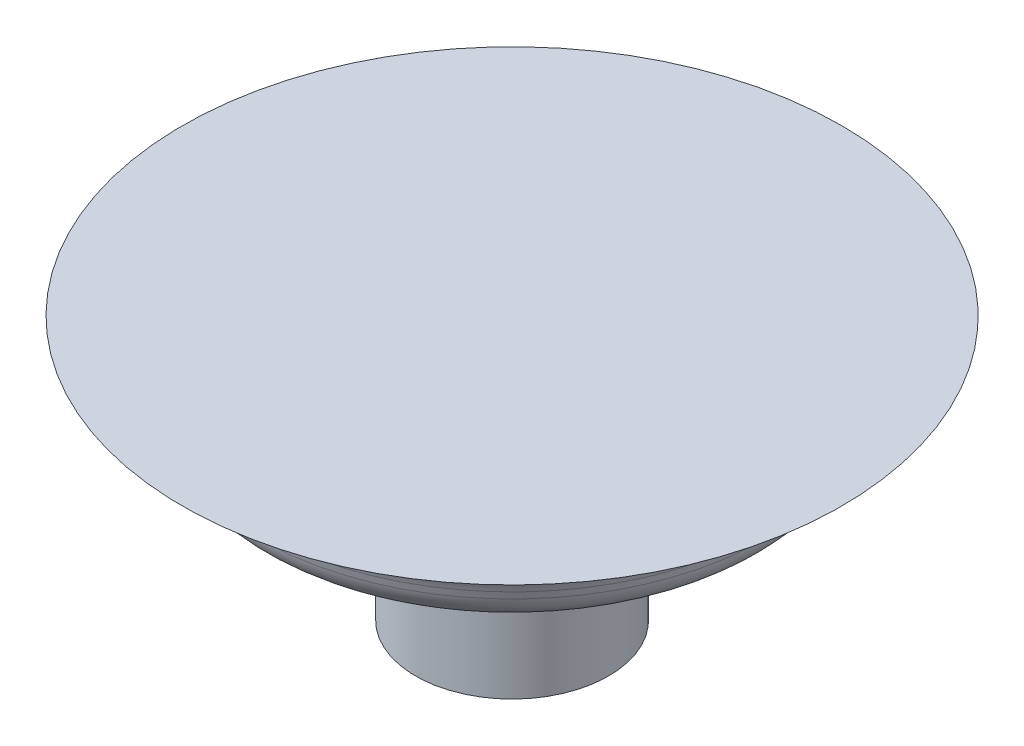
ISO-10303-21;
HEADER;
FILE_DESCRIPTION(('STEP AP214'),'2;1');
FILE_NAME('part.step','',(''),(''),'','','');
FILE_SCHEMA(('AUTOMOTIVE_DESIGN { 1 0 10303 214 1 1 1 1 }'));
ENDSEC;
DATA;
#1=APPLICATION_CONTEXT('core data for automotive mechanical design processes');
#2=APPLICATION_PROTOCOL_DEFINITION('international standard','automotive_design',2000,#1);
#3=PRODUCT_CONTEXT('',#1,'mechanical');
#4=PRODUCT('Part','Part','',(#3));
#5=PRODUCT_RELATED_PRODUCT_CATEGORY('part','',(#4));
#6=PRODUCT_DEFINITION_FORMATION('','',#4);
#7=PRODUCT_DEFINITION_CONTEXT('part definition',#1,'design');
#8=PRODUCT_DEFINITION('design','',#6,#7);
#9=PRODUCT_DEFINITION_SHAPE('','',#8);
#10=(LENGTH_UNIT() NAMED_UNIT(*) SI_UNIT(.MILLI.,.METRE.));
#11=(NAMED_UNIT(*) PLANE_ANGLE_UNIT() SI_UNIT($,.RADIAN.));
#12=(NAMED_UNIT(*) SI_UNIT($,.STERADIAN.) SOLID_ANGLE_UNIT());
#13=UNCERTAINTY_MEASURE_WITH_UNIT(LENGTH_MEASURE(1.E-05),#10,'distance_accuracy_value','');
#14=(GEOMETRIC_REPRESENTATION_CONTEXT(3) GLOBAL_UNCERTAINTY_ASSIGNED_CONTEXT((#13)) GLOBAL_UNIT_ASSIGNED_CONTEXT((#10,
#11,#12)) REPRESENTATION_CONTEXT('',''));
#15=CARTESIAN_POINT('',(0.,0.,0.));
#16=DIRECTION('',(0.,0.,1.));
#17=DIRECTION('',(1.,0.,0.));
#18=AXIS2_PLACEMENT_3D('',#15,#16,#17);
#19=CARTESIAN_POINT('',(0.,0.,0.));
#20=DIRECTION('',(0.,1.,0.));
#21=DIRECTION('',(0.,0.,1.));
#22=AXIS2_PLACEMENT_3D('',#19,#20,#21);
#23=PLANE('',#22);
#24=CARTESIAN_POINT('',(0.,0.,0.));
#25=DIRECTION('',(0.,-1.,0.));
#26=DIRECTION('',(0.,0.,-1.));
#27=AXIS2_PLACEMENT_3D('',#24,#25,#26);
#28=CIRCLE('',#27,3.5);
#29=CARTESIAN_POINT('',(0.,0.,-3.5));
#30=VERTEX_POINT('',#29);
#31=EDGE_CURVE('E60',#30,#30,#28,.T.);
#32=ORIENTED_EDGE('',*,*,#31,.F.);
#33=EDGE_LOOP('',(#32));
#34=FACE_BOUND('',#33,.T.);
#35=ADVANCED_FACE('F38',(#34),#23,.T.);
#36=CARTESIAN_POINT('',(0.,-2.8,0.));
#37=DIRECTION('',(0.,-1.,0.));
#38=DIRECTION('',(0.,0.,-1.));
#39=AXIS2_PLACEMENT_3D('',#36,#37,#38);
#40=PLANE('',#39);
#41=CARTESIAN_POINT('',(0.,-2.8,0.));
#42=DIRECTION('',(0.,-1.,0.));
#43=DIRECTION('',(0.,0.,-1.));
#44=AXIS2_PLACEMENT_3D('',#41,#42,#43);
#45=CIRCLE('',#44,1.025);
#46=CARTESIAN_POINT('',(0.,-2.8,-1.025));
#47=VERTEX_POINT('',#46);
#48=EDGE_CURVE('E11',#47,#47,#45,.T.);
#49=ORIENTED_EDGE('',*,*,#48,.T.);
#50=EDGE_LOOP('',(#49));
#51=FACE_BOUND('',#50,.T.);
#52=ADVANCED_FACE('F68',(#51),#40,.T.);
#53=CARTESIAN_POINT('',(0.,0.,0.));
#54=DIRECTION('',(0.,-1.,0.));
#55=DIRECTION('',(0.,0.,-1.));
#56=AXIS2_PLACEMENT_3D('',#53,#54,#55);
#57=CYLINDRICAL_SURFACE('',#56,1.025);
#58=CARTESIAN_POINT('',(0.,-1.,0.));
#59=DIRECTION('',(0.,-1.,0.));
#60=DIRECTION('',(0.,0.,-1.));
#61=AXIS2_PLACEMENT_3D('',#58,#59,#60);
#62=CIRCLE('',#61,1.025);
#63=CARTESIAN_POINT('',(0.,-1.,-1.025));
#64=VERTEX_POINT('',#63);
#65=EDGE_CURVE('E44',#64,#64,#62,.T.);
#66=ORIENTED_EDGE('',*,*,#65,.T.);
#67=EDGE_LOOP('',(#66));
#68=FACE_BOUND('',#67,.T.);
#69=ORIENTED_EDGE('',*,*,#48,.F.);
#70=EDGE_LOOP('',(#69));
#71=FACE_BOUND('',#70,.T.);
#72=ADVANCED_FACE('F72',(#68,#71),#57,.T.);
#73=CARTESIAN_POINT('',(1.025,-1.,0.));
#74=DIRECTION('',(0.,-1.,0.));
#75=DIRECTION('',(0.,0.,-1.));
#76=AXIS2_PLACEMENT_3D('',#73,#74,#75);
#77=PLANE('',#76);
#78=CARTESIAN_POINT('',(0.,-1.,0.));
#79=DIRECTION('',(0.,-1.,0.));
#80=DIRECTION('',(0.,0.,-1.));
#81=AXIS2_PLACEMENT_3D('',#78,#79,#80);
#82=CIRCLE('',#81,2.31408679581417);
#83=CARTESIAN_POINT('',(0.,-1.,-2.31408679581417));
#84=VERTEX_POINT('',#83);
#85=EDGE_CURVE('E48',#84,#84,#82,.T.);
#86=ORIENTED_EDGE('',*,*,#85,.T.);
#87=EDGE_LOOP('',(#86));
#88=FACE_BOUND('',#87,.T.);
#89=ORIENTED_EDGE('',*,*,#65,.F.);
#90=EDGE_LOOP('',(#89));
#91=FACE_BOUND('',#90,.T.);
#92=ADVANCED_FACE('F76',(#88,#91),#77,.T.);
#93=CARTESIAN_POINT('',(0.,-0.6,0.));
#94=DIRECTION('',(0.,-1.,0.));
#95=DIRECTION('',(0.,0.,-1.));
#96=AXIS2_PLACEMENT_3D('',#93,#94,#95);
#97=TOROIDAL_SURFACE('',#96,2.31408679581417,0.4);
#98=CARTESIAN_POINT('',(0.,-0.692589087765782,0.));
#99=DIRECTION('',(0.,-1.,0.));
#100=DIRECTION('',(0.,0.,-1.));
#101=AXIS2_PLACEMENT_3D('',#98,#99,#100);
#102=CIRCLE('',#101,2.70322335388434);
#103=CARTESIAN_POINT('',(0.,-0.692589087765782,-2.70322335388434));
#104=VERTEX_POINT('',#103);
#105=EDGE_CURVE('E52',#104,#104,#102,.T.);
#106=ORIENTED_EDGE('',*,*,#105,.T.);
#107=EDGE_LOOP('',(#106));
#108=FACE_BOUND('',#107,.T.);
#109=ORIENTED_EDGE('',*,*,#85,.F.);
#110=EDGE_LOOP('',(#109));
#111=FACE_BOUND('',#110,.T.);
#112=ADVANCED_FACE('F81',(#108,#111),#97,.T.);
#113=CARTESIAN_POINT('',(0.,-0.692589087765782,0.));
#114=DIRECTION('',(0.,1.,0.));
#115=DIRECTION('',(0.,0.,1.));
#116=AXIS2_PLACEMENT_3D('',#113,#114,#115);
#117=CONICAL_SURFACE('',#116,2.70322335388434,0.233591243909141);
#118=CARTESIAN_POINT('',(0.,-0.614821824468437,0.));
#119=DIRECTION('',(0.,-1.,0.));
#120=DIRECTION('',(0.,0.,-1.));
#121=AXIS2_PLACEMENT_3D('',#118,#119,#120);
#122=CIRCLE('',#121,2.72172688385966);
#123=CARTESIAN_POINT('',(0.,-0.614821824468437,-2.72172688385966));
#124=VERTEX_POINT('',#123);
#125=EDGE_CURVE('E57',#124,#124,#122,.T.);
#126=ORIENTED_EDGE('',*,*,#125,.T.);
#127=EDGE_LOOP('',(#126));
#128=FACE_BOUND('',#127,.T.);
#129=ORIENTED_EDGE('',*,*,#105,.F.);
#130=EDGE_LOOP('',(#129));
#131=FACE_BOUND('',#130,.T.);
#132=ADVANCED_FACE('F85',(#128,#131),#117,.T.);
#133=CARTESIAN_POINT('',(0.,-0.8,0.));
#134=DIRECTION('',(0.,-1.,0.));
#135=DIRECTION('',(0.,0.,-1.));
#136=AXIS2_PLACEMENT_3D('',#133,#134,#135);
#137=TOROIDAL_SURFACE('',#136,3.5,0.8);
#138=ORIENTED_EDGE('',*,*,#31,.T.);
#139=EDGE_LOOP('',(#138));
#140=FACE_BOUND('',#139,.T.);
#141=ORIENTED_EDGE('',*,*,#125,.F.);
#142=EDGE_LOOP('',(#141));
#143=FACE_BOUND('',#142,.T.);
#144=ADVANCED_FACE('F64',(#140,#143),#137,.F.);
#145=CLOSED_SHELL('',(#35,#52,#72,#92,#112,#132,#144));
#146=MANIFOLD_SOLID_BREP('B2',#145);
#147=ADVANCED_BREP_SHAPE_REPRESENTATION('',(#18,#146),#14);
#148=SHAPE_DEFINITION_REPRESENTATION(#9,#147);
ENDSEC;
END-ISO-10303-21;
